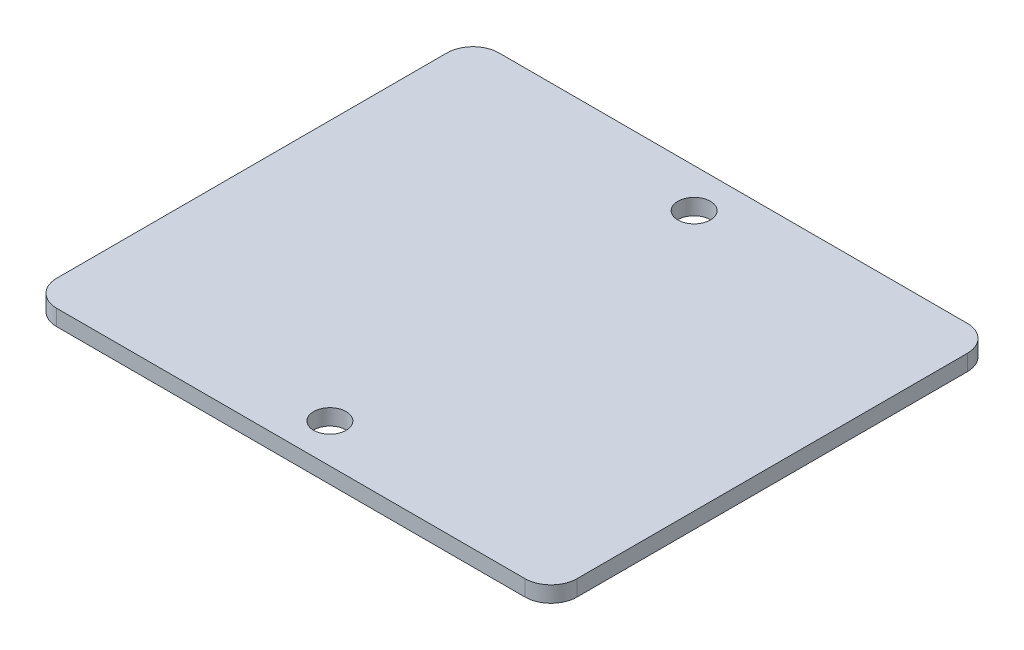
ISO-10303-21;
HEADER;
FILE_DESCRIPTION(('STEP AP214'),'2;1');
FILE_NAME('part.step','',(''),(''),'','','');
FILE_SCHEMA(('AUTOMOTIVE_DESIGN { 1 0 10303 214 1 1 1 1 }'));
ENDSEC;
DATA;
#1=APPLICATION_CONTEXT('core data for automotive mechanical design processes');
#2=APPLICATION_PROTOCOL_DEFINITION('international standard','automotive_design',2000,#1);
#3=PRODUCT_CONTEXT('',#1,'mechanical');
#4=PRODUCT('Part','Part','',(#3));
#5=PRODUCT_RELATED_PRODUCT_CATEGORY('part','',(#4));
#6=PRODUCT_DEFINITION_FORMATION('','',#4);
#7=PRODUCT_DEFINITION_CONTEXT('part definition',#1,'design');
#8=PRODUCT_DEFINITION('design','',#6,#7);
#9=PRODUCT_DEFINITION_SHAPE('','',#8);
#10=(LENGTH_UNIT() NAMED_UNIT(*) SI_UNIT(.MILLI.,.METRE.));
#11=(NAMED_UNIT(*) PLANE_ANGLE_UNIT() SI_UNIT($,.RADIAN.));
#12=(NAMED_UNIT(*) SI_UNIT($,.STERADIAN.) SOLID_ANGLE_UNIT());
#13=UNCERTAINTY_MEASURE_WITH_UNIT(LENGTH_MEASURE(1.E-05),#10,'distance_accuracy_value','');
#14=(GEOMETRIC_REPRESENTATION_CONTEXT(3) GLOBAL_UNCERTAINTY_ASSIGNED_CONTEXT((#13)) GLOBAL_UNIT_ASSIGNED_CONTEXT((#10,
#11,#12)) REPRESENTATION_CONTEXT('',''));
#15=CARTESIAN_POINT('',(0.,0.,0.));
#16=DIRECTION('',(0.,0.,1.));
#17=DIRECTION('',(1.,0.,0.));
#18=AXIS2_PLACEMENT_3D('',#15,#16,#17);
#19=CARTESIAN_POINT('',(0.,1.56,0.));
#20=DIRECTION('',(0.,-1.,0.));
#21=DIRECTION('',(0.,0.,-1.));
#22=AXIS2_PLACEMENT_3D('',#19,#20,#21);
#23=PLANE('',#22);
#24=DIRECTION('',(-1.,0.,0.));
#25=VECTOR('',#24,1.);
#26=CARTESIAN_POINT('',(-25.4,1.56,-21.59));
#27=LINE('',#26,#25);
#28=CARTESIAN_POINT('',(22.86,1.56,-21.59));
#29=VERTEX_POINT('',#28);
#30=CARTESIAN_POINT('',(-22.86,1.56,-21.59));
#31=VERTEX_POINT('',#30);
#32=EDGE_CURVE('E168',#29,#31,#27,.T.);
#33=ORIENTED_EDGE('',*,*,#32,.T.);
#34=CARTESIAN_POINT('',(-22.86,1.56,-19.05));
#35=DIRECTION('',(0.,-1.,0.));
#36=DIRECTION('',(0.,0.,-1.));
#37=AXIS2_PLACEMENT_3D('',#34,#35,#36);
#38=CIRCLE('',#37,2.54);
#39=CARTESIAN_POINT('',(-25.4,1.56,-19.05));
#40=VERTEX_POINT('',#39);
#41=EDGE_CURVE('E149',#31,#40,#38,.F.);
#42=ORIENTED_EDGE('',*,*,#41,.T.);
#43=DIRECTION('',(0.,0.,1.));
#44=VECTOR('',#43,1.);
#45=CARTESIAN_POINT('',(-25.4,1.56,21.59));
#46=LINE('',#45,#44);
#47=CARTESIAN_POINT('',(-25.4,1.56,19.05));
#48=VERTEX_POINT('',#47);
#49=EDGE_CURVE('E119',#40,#48,#46,.T.);
#50=ORIENTED_EDGE('',*,*,#49,.T.);
#51=CARTESIAN_POINT('',(-22.86,1.56,19.05));
#52=DIRECTION('',(0.,-1.,0.));
#53=DIRECTION('',(0.,0.,-1.));
#54=AXIS2_PLACEMENT_3D('',#51,#52,#53);
#55=CIRCLE('',#54,2.54);
#56=CARTESIAN_POINT('',(-22.86,1.56,21.59));
#57=VERTEX_POINT('',#56);
#58=EDGE_CURVE('E55',#48,#57,#55,.F.);
#59=ORIENTED_EDGE('',*,*,#58,.T.);
#60=DIRECTION('',(1.,0.,0.));
#61=VECTOR('',#60,1.);
#62=CARTESIAN_POINT('',(-25.4,1.56,21.59));
#63=LINE('',#62,#61);
#64=CARTESIAN_POINT('',(22.86,1.56,21.59));
#65=VERTEX_POINT('',#64);
#66=EDGE_CURVE('E135',#57,#65,#63,.T.);
#67=ORIENTED_EDGE('',*,*,#66,.T.);
#68=CARTESIAN_POINT('',(22.86,1.56,19.05));
#69=DIRECTION('',(0.,-1.,0.));
#70=DIRECTION('',(0.,0.,-1.));
#71=AXIS2_PLACEMENT_3D('',#68,#69,#70);
#72=CIRCLE('',#71,2.54);
#73=CARTESIAN_POINT('',(25.4,1.56,19.05));
#74=VERTEX_POINT('',#73);
#75=EDGE_CURVE('E146',#65,#74,#72,.F.);
#76=ORIENTED_EDGE('',*,*,#75,.T.);
#77=DIRECTION('',(0.,0.,-1.));
#78=VECTOR('',#77,1.);
#79=CARTESIAN_POINT('',(25.4,1.56,21.59));
#80=LINE('',#79,#78);
#81=CARTESIAN_POINT('',(25.4,1.56,-19.05));
#82=VERTEX_POINT('',#81);
#83=EDGE_CURVE('E129',#74,#82,#80,.T.);
#84=ORIENTED_EDGE('',*,*,#83,.T.);
#85=CARTESIAN_POINT('',(22.86,1.56,-19.05));
#86=DIRECTION('',(0.,-1.,0.));
#87=DIRECTION('',(0.,0.,-1.));
#88=AXIS2_PLACEMENT_3D('',#85,#86,#87);
#89=CIRCLE('',#88,2.54);
#90=EDGE_CURVE('E144',#82,#29,#89,.F.);
#91=ORIENTED_EDGE('',*,*,#90,.T.);
#92=EDGE_LOOP('',(#33,#42,#50,#59,#67,#76,#84,#91));
#93=FACE_BOUND('',#92,.T.);
#94=CARTESIAN_POINT('',(0.,1.56,-17.78));
#95=DIRECTION('',(0.,1.,0.));
#96=DIRECTION('',(0.,0.,1.));
#97=AXIS2_PLACEMENT_3D('',#94,#95,#96);
#98=CIRCLE('',#97,1.5875);
#99=CARTESIAN_POINT('',(0.,1.56,-19.3675));
#100=VERTEX_POINT('',#99);
#101=EDGE_CURVE('E173',#100,#100,#98,.T.);
#102=ORIENTED_EDGE('',*,*,#101,.F.);
#103=EDGE_LOOP('',(#102));
#104=FACE_BOUND('',#103,.T.);
#105=CARTESIAN_POINT('',(0.,1.56,17.78));
#106=DIRECTION('',(0.,1.,0.));
#107=DIRECTION('',(0.,0.,-1.));
#108=AXIS2_PLACEMENT_3D('',#105,#106,#107);
#109=CIRCLE('',#108,1.5875);
#110=CARTESIAN_POINT('',(0.,1.56,16.1925));
#111=VERTEX_POINT('',#110);
#112=EDGE_CURVE('E182',#111,#111,#109,.T.);
#113=ORIENTED_EDGE('',*,*,#112,.F.);
#114=EDGE_LOOP('',(#113));
#115=FACE_BOUND('',#114,.T.);
#116=ADVANCED_FACE('F33',(#93,#104,#115),#23,.F.);
#117=CARTESIAN_POINT('',(0.,0.,0.));
#118=DIRECTION('',(0.,-1.,0.));
#119=DIRECTION('',(0.,0.,-1.));
#120=AXIS2_PLACEMENT_3D('',#117,#118,#119);
#121=PLANE('',#120);
#122=CARTESIAN_POINT('',(0.,0.,-17.78));
#123=DIRECTION('',(0.,1.,0.));
#124=DIRECTION('',(0.,0.,1.));
#125=AXIS2_PLACEMENT_3D('',#122,#123,#124);
#126=CIRCLE('',#125,1.5875);
#127=CARTESIAN_POINT('',(0.,0.,-19.3675));
#128=VERTEX_POINT('',#127);
#129=EDGE_CURVE('E175',#128,#128,#126,.T.);
#130=ORIENTED_EDGE('',*,*,#129,.T.);
#131=EDGE_LOOP('',(#130));
#132=FACE_BOUND('',#131,.T.);
#133=DIRECTION('',(0.,0.,1.));
#134=VECTOR('',#133,1.);
#135=CARTESIAN_POINT('',(-25.4,0.,21.59));
#136=LINE('',#135,#134);
#137=CARTESIAN_POINT('',(-25.4,0.,-19.05));
#138=VERTEX_POINT('',#137);
#139=CARTESIAN_POINT('',(-25.4,0.,19.05));
#140=VERTEX_POINT('',#139);
#141=EDGE_CURVE('E117',#138,#140,#136,.T.);
#142=ORIENTED_EDGE('',*,*,#141,.F.);
#143=CARTESIAN_POINT('',(-22.86,0.,-19.05));
#144=DIRECTION('',(0.,-1.,0.));
#145=DIRECTION('',(0.,0.,-1.));
#146=AXIS2_PLACEMENT_3D('',#143,#144,#145);
#147=CIRCLE('',#146,2.54);
#148=CARTESIAN_POINT('',(-22.86,0.,-21.59));
#149=VERTEX_POINT('',#148);
#150=EDGE_CURVE('E100',#138,#149,#147,.T.);
#151=ORIENTED_EDGE('',*,*,#150,.T.);
#152=DIRECTION('',(-1.,0.,0.));
#153=VECTOR('',#152,1.);
#154=CARTESIAN_POINT('',(-25.4,0.,-21.59));
#155=LINE('',#154,#153);
#156=CARTESIAN_POINT('',(22.86,0.,-21.59));
#157=VERTEX_POINT('',#156);
#158=EDGE_CURVE('E127',#157,#149,#155,.T.);
#159=ORIENTED_EDGE('',*,*,#158,.F.);
#160=CARTESIAN_POINT('',(22.86,0.,-19.05));
#161=DIRECTION('',(0.,-1.,0.));
#162=DIRECTION('',(0.,0.,-1.));
#163=AXIS2_PLACEMENT_3D('',#160,#161,#162);
#164=CIRCLE('',#163,2.54);
#165=CARTESIAN_POINT('',(25.4,0.,-19.05));
#166=VERTEX_POINT('',#165);
#167=EDGE_CURVE('E120',#157,#166,#164,.T.);
#168=ORIENTED_EDGE('',*,*,#167,.T.);
#169=DIRECTION('',(0.,0.,-1.));
#170=VECTOR('',#169,1.);
#171=CARTESIAN_POINT('',(25.4,0.,21.59));
#172=LINE('',#171,#170);
#173=CARTESIAN_POINT('',(25.4,0.,19.05));
#174=VERTEX_POINT('',#173);
#175=EDGE_CURVE('E131',#174,#166,#172,.T.);
#176=ORIENTED_EDGE('',*,*,#175,.F.);
#177=CARTESIAN_POINT('',(22.86,0.,19.05));
#178=DIRECTION('',(0.,-1.,0.));
#179=DIRECTION('',(0.,0.,-1.));
#180=AXIS2_PLACEMENT_3D('',#177,#178,#179);
#181=CIRCLE('',#180,2.54);
#182=CARTESIAN_POINT('',(22.86,0.,21.59));
#183=VERTEX_POINT('',#182);
#184=EDGE_CURVE('E138',#174,#183,#181,.T.);
#185=ORIENTED_EDGE('',*,*,#184,.T.);
#186=DIRECTION('',(1.,0.,0.));
#187=VECTOR('',#186,1.);
#188=CARTESIAN_POINT('',(-25.4,0.,21.59));
#189=LINE('',#188,#187);
#190=CARTESIAN_POINT('',(-22.86,0.,21.59));
#191=VERTEX_POINT('',#190);
#192=EDGE_CURVE('E126',#191,#183,#189,.T.);
#193=ORIENTED_EDGE('',*,*,#192,.F.);
#194=CARTESIAN_POINT('',(-22.86,0.,19.05));
#195=DIRECTION('',(0.,-1.,0.));
#196=DIRECTION('',(0.,0.,-1.));
#197=AXIS2_PLACEMENT_3D('',#194,#195,#196);
#198=CIRCLE('',#197,2.54);
#199=EDGE_CURVE('E111',#191,#140,#198,.T.);
#200=ORIENTED_EDGE('',*,*,#199,.T.);
#201=EDGE_LOOP('',(#142,#151,#159,#168,#176,#185,#193,#200));
#202=FACE_BOUND('',#201,.T.);
#203=CARTESIAN_POINT('',(0.,0.,17.78));
#204=DIRECTION('',(0.,1.,0.));
#205=DIRECTION('',(0.,0.,-1.));
#206=AXIS2_PLACEMENT_3D('',#203,#204,#205);
#207=CIRCLE('',#206,1.5875);
#208=CARTESIAN_POINT('',(0.,0.,16.1925));
#209=VERTEX_POINT('',#208);
#210=EDGE_CURVE('E184',#209,#209,#207,.T.);
#211=ORIENTED_EDGE('',*,*,#210,.T.);
#212=EDGE_LOOP('',(#211));
#213=FACE_BOUND('',#212,.T.);
#214=ADVANCED_FACE('F123',(#132,#202,#213),#121,.T.);
#215=CARTESIAN_POINT('',(25.4,1.56,21.59));
#216=DIRECTION('',(-1.,0.,0.));
#217=DIRECTION('',(0.,0.,1.));
#218=AXIS2_PLACEMENT_3D('',#215,#216,#217);
#219=PLANE('',#218);
#220=ORIENTED_EDGE('',*,*,#83,.F.);
#221=DIRECTION('',(0.,-1.,0.));
#222=VECTOR('',#221,1.);
#223=CARTESIAN_POINT('',(25.4,1.56,19.05));
#224=LINE('',#223,#222);
#225=EDGE_CURVE('E11',#74,#174,#224,.T.);
#226=ORIENTED_EDGE('',*,*,#225,.T.);
#227=ORIENTED_EDGE('',*,*,#175,.T.);
#228=DIRECTION('',(0.,-1.,0.));
#229=VECTOR('',#228,1.);
#230=CARTESIAN_POINT('',(25.4,1.56,-19.05));
#231=LINE('',#230,#229);
#232=EDGE_CURVE('E41',#166,#82,#231,.F.);
#233=ORIENTED_EDGE('',*,*,#232,.T.);
#234=EDGE_LOOP('',(#220,#226,#227,#233));
#235=FACE_BOUND('',#234,.T.);
#236=ADVANCED_FACE('F159',(#235),#219,.F.);
#237=CARTESIAN_POINT('',(-25.4,1.56,-21.59));
#238=DIRECTION('',(0.,0.,1.));
#239=DIRECTION('',(1.,0.,0.));
#240=AXIS2_PLACEMENT_3D('',#237,#238,#239);
#241=PLANE('',#240);
#242=ORIENTED_EDGE('',*,*,#158,.T.);
#243=DIRECTION('',(0.,-1.,0.));
#244=VECTOR('',#243,1.);
#245=CARTESIAN_POINT('',(-22.86,1.56,-21.59));
#246=LINE('',#245,#244);
#247=EDGE_CURVE('E105',#149,#31,#246,.F.);
#248=ORIENTED_EDGE('',*,*,#247,.T.);
#249=ORIENTED_EDGE('',*,*,#32,.F.);
#250=DIRECTION('',(0.,-1.,0.));
#251=VECTOR('',#250,1.);
#252=CARTESIAN_POINT('',(22.86,1.56,-21.59));
#253=LINE('',#252,#251);
#254=EDGE_CURVE('E110',#29,#157,#253,.T.);
#255=ORIENTED_EDGE('',*,*,#254,.T.);
#256=EDGE_LOOP('',(#242,#248,#249,#255));
#257=FACE_BOUND('',#256,.T.);
#258=ADVANCED_FACE('F172',(#257),#241,.F.);
#259=CARTESIAN_POINT('',(-25.4,1.56,21.59));
#260=DIRECTION('',(1.,0.,0.));
#261=DIRECTION('',(0.,0.,-1.));
#262=AXIS2_PLACEMENT_3D('',#259,#260,#261);
#263=PLANE('',#262);
#264=ORIENTED_EDGE('',*,*,#49,.F.);
#265=DIRECTION('',(0.,-1.,0.));
#266=VECTOR('',#265,1.);
#267=CARTESIAN_POINT('',(-25.4,1.56,-19.05));
#268=LINE('',#267,#266);
#269=EDGE_CURVE('E104',#40,#138,#268,.T.);
#270=ORIENTED_EDGE('',*,*,#269,.T.);
#271=ORIENTED_EDGE('',*,*,#141,.T.);
#272=DIRECTION('',(0.,-1.,0.));
#273=VECTOR('',#272,1.);
#274=CARTESIAN_POINT('',(-25.4,1.56,19.05));
#275=LINE('',#274,#273);
#276=EDGE_CURVE('E121',#140,#48,#275,.F.);
#277=ORIENTED_EDGE('',*,*,#276,.T.);
#278=EDGE_LOOP('',(#264,#270,#271,#277));
#279=FACE_BOUND('',#278,.T.);
#280=ADVANCED_FACE('F116',(#279),#263,.F.);
#281=CARTESIAN_POINT('',(-25.4,1.56,21.59));
#282=DIRECTION('',(0.,0.,-1.));
#283=DIRECTION('',(-1.,0.,0.));
#284=AXIS2_PLACEMENT_3D('',#281,#282,#283);
#285=PLANE('',#284);
#286=ORIENTED_EDGE('',*,*,#66,.F.);
#287=DIRECTION('',(0.,-1.,0.));
#288=VECTOR('',#287,1.);
#289=CARTESIAN_POINT('',(-22.86,1.56,21.59));
#290=LINE('',#289,#288);
#291=EDGE_CURVE('E152',#57,#191,#290,.T.);
#292=ORIENTED_EDGE('',*,*,#291,.T.);
#293=ORIENTED_EDGE('',*,*,#192,.T.);
#294=DIRECTION('',(0.,-1.,0.));
#295=VECTOR('',#294,1.);
#296=CARTESIAN_POINT('',(22.86,1.56,21.59));
#297=LINE('',#296,#295);
#298=EDGE_CURVE('E48',#183,#65,#297,.F.);
#299=ORIENTED_EDGE('',*,*,#298,.T.);
#300=EDGE_LOOP('',(#286,#292,#293,#299));
#301=FACE_BOUND('',#300,.T.);
#302=ADVANCED_FACE('F204',(#301),#285,.F.);
#303=CARTESIAN_POINT('',(0.,1.56,-17.78));
#304=DIRECTION('',(0.,-1.,0.));
#305=DIRECTION('',(0.,0.,-1.));
#306=AXIS2_PLACEMENT_3D('',#303,#304,#305);
#307=CYLINDRICAL_SURFACE('',#306,1.5875);
#308=CARTESIAN_POINT('',(0.,1.56,-19.3675));
#309=CARTESIAN_POINT('',(0.,1.54375,-19.3675));
#310=CARTESIAN_POINT('',(0.,1.5275,-19.3675));
#311=CARTESIAN_POINT('',(0.,1.495,-19.3675));
#312=CARTESIAN_POINT('',(0.,1.47875,-19.3675));
#313=CARTESIAN_POINT('',(0.,1.44625,-19.3675));
#314=CARTESIAN_POINT('',(0.,1.43,-19.3675));
#315=CARTESIAN_POINT('',(0.,1.3975,-19.3675));
#316=CARTESIAN_POINT('',(0.,1.38125,-19.3675));
#317=CARTESIAN_POINT('',(0.,1.34875,-19.3675));
#318=CARTESIAN_POINT('',(0.,1.3325,-19.3675));
#319=CARTESIAN_POINT('',(0.,1.3,-19.3675));
#320=CARTESIAN_POINT('',(0.,1.28375,-19.3675));
#321=CARTESIAN_POINT('',(0.,1.25125,-19.3675));
#322=CARTESIAN_POINT('',(0.,1.235,-19.3675));
#323=CARTESIAN_POINT('',(0.,1.2025,-19.3675));
#324=CARTESIAN_POINT('',(0.,1.18625,-19.3675));
#325=CARTESIAN_POINT('',(0.,1.15375,-19.3675));
#326=CARTESIAN_POINT('',(0.,1.1375,-19.3675));
#327=CARTESIAN_POINT('',(0.,1.105,-19.3675));
#328=CARTESIAN_POINT('',(0.,1.08875,-19.3675));
#329=CARTESIAN_POINT('',(0.,1.05625,-19.3675));
#330=CARTESIAN_POINT('',(0.,1.04,-19.3675));
#331=CARTESIAN_POINT('',(0.,1.0075,-19.3675));
#332=CARTESIAN_POINT('',(0.,0.99125,-19.3675));
#333=CARTESIAN_POINT('',(0.,0.95875,-19.3675));
#334=CARTESIAN_POINT('',(0.,0.9425,-19.3675));
#335=CARTESIAN_POINT('',(0.,0.91,-19.3675));
#336=CARTESIAN_POINT('',(0.,0.89375,-19.3675));
#337=CARTESIAN_POINT('',(0.,0.86125,-19.3675));
#338=CARTESIAN_POINT('',(0.,0.845,-19.3675));
#339=CARTESIAN_POINT('',(0.,0.8125,-19.3675));
#340=CARTESIAN_POINT('',(0.,0.79625,-19.3675));
#341=CARTESIAN_POINT('',(0.,0.76375,-19.3675));
#342=CARTESIAN_POINT('',(0.,0.7475,-19.3675));
#343=CARTESIAN_POINT('',(0.,0.715,-19.3675));
#344=CARTESIAN_POINT('',(0.,0.69875,-19.3675));
#345=CARTESIAN_POINT('',(0.,0.66625,-19.3675));
#346=CARTESIAN_POINT('',(0.,0.65,-19.3675));
#347=CARTESIAN_POINT('',(0.,0.6175,-19.3675));
#348=CARTESIAN_POINT('',(0.,0.60125,-19.3675));
#349=CARTESIAN_POINT('',(0.,0.56875,-19.3675));
#350=CARTESIAN_POINT('',(0.,0.5525,-19.3675));
#351=CARTESIAN_POINT('',(0.,0.52,-19.3675));
#352=CARTESIAN_POINT('',(0.,0.50375,-19.3675));
#353=CARTESIAN_POINT('',(0.,0.47125,-19.3675));
#354=CARTESIAN_POINT('',(0.,0.455,-19.3675));
#355=CARTESIAN_POINT('',(0.,0.4225,-19.3675));
#356=CARTESIAN_POINT('',(0.,0.40625,-19.3675));
#357=CARTESIAN_POINT('',(0.,0.37375,-19.3675));
#358=CARTESIAN_POINT('',(0.,0.3575,-19.3675));
#359=CARTESIAN_POINT('',(0.,0.325,-19.3675));
#360=CARTESIAN_POINT('',(0.,0.30875,-19.3675));
#361=CARTESIAN_POINT('',(0.,0.27625,-19.3675));
#362=CARTESIAN_POINT('',(0.,0.26,-19.3675));
#363=CARTESIAN_POINT('',(0.,0.2275,-19.3675));
#364=CARTESIAN_POINT('',(0.,0.21125,-19.3675));
#365=CARTESIAN_POINT('',(0.,0.17875,-19.3675));
#366=CARTESIAN_POINT('',(0.,0.1625,-19.3675));
#367=CARTESIAN_POINT('',(0.,0.13,-19.3675));
#368=CARTESIAN_POINT('',(0.,0.11375,-19.3675));
#369=CARTESIAN_POINT('',(0.,0.0812499999999999,-19.3675));
#370=CARTESIAN_POINT('',(0.,0.0649999999999999,-19.3675));
#371=CARTESIAN_POINT('',(0.,0.0325,-19.3675));
#372=CARTESIAN_POINT('',(0.,0.01625,-19.3675));
#373=CARTESIAN_POINT('',(0.,0.,-19.3675));
#374=B_SPLINE_CURVE_WITH_KNOTS('',3,(#308,#309,#310,#311,#312,#313,#314,#315,#316,#317,#318,
#319,#320,#321,#322,#323,#324,#325,#326,#327,#328,#329,#330,#331,#332,#333,#334,#335,#336,#337,
#338,#339,#340,#341,#342,#343,#344,#345,#346,#347,#348,#349,#350,#351,#352,#353,#354,#355,#356,
#357,#358,#359,#360,#361,#362,#363,#364,#365,#366,#367,#368,#369,#370,#371,#372,#373),
.UNSPECIFIED.,.F.,.F.,(4,2,2,2,2,2,2,2,2,2,2,2,2,2,2,2,2,2,2,2,2,2,2,2,2,2,2,2,2,2,2,2,4),(0.,
0.04875,0.0974999999999999,0.14625,0.195,0.24375,0.2925,0.34125,0.39,0.43875,0.4875,0.53625,
0.585,0.63375,0.6825,0.73125,0.78,0.82875,0.8775,0.92625,0.975,1.02375,1.0725,1.12125,1.17,
1.21875,1.2675,1.31625,1.365,1.41375,1.4625,1.51125,1.56),.UNSPECIFIED.);
#375=EDGE_CURVE('BSEAM201',#100,#128,#374,.T.);
#376=ORIENTED_EDGE('',*,*,#101,.T.);
#377=ORIENTED_EDGE('',*,*,#129,.F.);
#378=ORIENTED_EDGE('',*,*,#375,.T.);
#379=ORIENTED_EDGE('',*,*,#375,.F.);
#380=EDGE_LOOP('',(#376,#378,#377,#379));
#381=FACE_BOUND('',#380,.T.);
#382=ADVANCED_FACE('F201',(#381),#307,.F.);
#383=CARTESIAN_POINT('',(0.,1.56,17.78));
#384=DIRECTION('',(0.,-1.,0.));
#385=DIRECTION('',(0.,0.,-1.));
#386=AXIS2_PLACEMENT_3D('',#383,#384,#385);
#387=CYLINDRICAL_SURFACE('',#386,1.5875);
#388=CARTESIAN_POINT('',(0.,1.56,16.1925));
#389=CARTESIAN_POINT('',(0.,1.54375,16.1925));
#390=CARTESIAN_POINT('',(0.,1.5275,16.1925));
#391=CARTESIAN_POINT('',(0.,1.495,16.1925));
#392=CARTESIAN_POINT('',(0.,1.47875,16.1925));
#393=CARTESIAN_POINT('',(0.,1.44625,16.1925));
#394=CARTESIAN_POINT('',(0.,1.43,16.1925));
#395=CARTESIAN_POINT('',(0.,1.3975,16.1925));
#396=CARTESIAN_POINT('',(0.,1.38125,16.1925));
#397=CARTESIAN_POINT('',(0.,1.34875,16.1925));
#398=CARTESIAN_POINT('',(0.,1.3325,16.1925));
#399=CARTESIAN_POINT('',(0.,1.3,16.1925));
#400=CARTESIAN_POINT('',(0.,1.28375,16.1925));
#401=CARTESIAN_POINT('',(0.,1.25125,16.1925));
#402=CARTESIAN_POINT('',(0.,1.235,16.1925));
#403=CARTESIAN_POINT('',(0.,1.2025,16.1925));
#404=CARTESIAN_POINT('',(0.,1.18625,16.1925));
#405=CARTESIAN_POINT('',(0.,1.15375,16.1925));
#406=CARTESIAN_POINT('',(0.,1.1375,16.1925));
#407=CARTESIAN_POINT('',(0.,1.105,16.1925));
#408=CARTESIAN_POINT('',(0.,1.08875,16.1925));
#409=CARTESIAN_POINT('',(0.,1.05625,16.1925));
#410=CARTESIAN_POINT('',(0.,1.04,16.1925));
#411=CARTESIAN_POINT('',(0.,1.0075,16.1925));
#412=CARTESIAN_POINT('',(0.,0.99125,16.1925));
#413=CARTESIAN_POINT('',(0.,0.95875,16.1925));
#414=CARTESIAN_POINT('',(0.,0.9425,16.1925));
#415=CARTESIAN_POINT('',(0.,0.91,16.1925));
#416=CARTESIAN_POINT('',(0.,0.89375,16.1925));
#417=CARTESIAN_POINT('',(0.,0.86125,16.1925));
#418=CARTESIAN_POINT('',(0.,0.845,16.1925));
#419=CARTESIAN_POINT('',(0.,0.8125,16.1925));
#420=CARTESIAN_POINT('',(0.,0.79625,16.1925));
#421=CARTESIAN_POINT('',(0.,0.76375,16.1925));
#422=CARTESIAN_POINT('',(0.,0.7475,16.1925));
#423=CARTESIAN_POINT('',(0.,0.715,16.1925));
#424=CARTESIAN_POINT('',(0.,0.69875,16.1925));
#425=CARTESIAN_POINT('',(0.,0.66625,16.1925));
#426=CARTESIAN_POINT('',(0.,0.65,16.1925));
#427=CARTESIAN_POINT('',(0.,0.6175,16.1925));
#428=CARTESIAN_POINT('',(0.,0.60125,16.1925));
#429=CARTESIAN_POINT('',(0.,0.56875,16.1925));
#430=CARTESIAN_POINT('',(0.,0.5525,16.1925));
#431=CARTESIAN_POINT('',(0.,0.52,16.1925));
#432=CARTESIAN_POINT('',(0.,0.50375,16.1925));
#433=CARTESIAN_POINT('',(0.,0.47125,16.1925));
#434=CARTESIAN_POINT('',(0.,0.455,16.1925));
#435=CARTESIAN_POINT('',(0.,0.4225,16.1925));
#436=CARTESIAN_POINT('',(0.,0.40625,16.1925));
#437=CARTESIAN_POINT('',(0.,0.37375,16.1925));
#438=CARTESIAN_POINT('',(0.,0.3575,16.1925));
#439=CARTESIAN_POINT('',(0.,0.325,16.1925));
#440=CARTESIAN_POINT('',(0.,0.30875,16.1925));
#441=CARTESIAN_POINT('',(0.,0.27625,16.1925));
#442=CARTESIAN_POINT('',(0.,0.26,16.1925));
#443=CARTESIAN_POINT('',(0.,0.2275,16.1925));
#444=CARTESIAN_POINT('',(0.,0.21125,16.1925));
#445=CARTESIAN_POINT('',(0.,0.17875,16.1925));
#446=CARTESIAN_POINT('',(0.,0.1625,16.1925));
#447=CARTESIAN_POINT('',(0.,0.13,16.1925));
#448=CARTESIAN_POINT('',(0.,0.11375,16.1925));
#449=CARTESIAN_POINT('',(0.,0.0812499999999999,16.1925));
#450=CARTESIAN_POINT('',(0.,0.0649999999999999,16.1925));
#451=CARTESIAN_POINT('',(0.,0.0325,16.1925));
#452=CARTESIAN_POINT('',(0.,0.01625,16.1925));
#453=CARTESIAN_POINT('',(0.,0.,16.1925));
#454=B_SPLINE_CURVE_WITH_KNOTS('',3,(#388,#389,#390,#391,#392,#393,#394,#395,#396,#397,#398,
#399,#400,#401,#402,#403,#404,#405,#406,#407,#408,#409,#410,#411,#412,#413,#414,#415,#416,#417,
#418,#419,#420,#421,#422,#423,#424,#425,#426,#427,#428,#429,#430,#431,#432,#433,#434,#435,#436,
#437,#438,#439,#440,#441,#442,#443,#444,#445,#446,#447,#448,#449,#450,#451,#452,#453),
.UNSPECIFIED.,.F.,.F.,(4,2,2,2,2,2,2,2,2,2,2,2,2,2,2,2,2,2,2,2,2,2,2,2,2,2,2,2,2,2,2,2,4),(0.,
0.04875,0.0974999999999999,0.14625,0.195,0.24375,0.2925,0.34125,0.39,0.43875,0.4875,0.53625,
0.585,0.63375,0.6825,0.73125,0.78,0.82875,0.8775,0.92625,0.975,1.02375,1.0725,1.12125,1.17,
1.21875,1.2675,1.31625,1.365,1.41375,1.4625,1.51125,1.56),.UNSPECIFIED.);
#455=EDGE_CURVE('BSEAM190',#111,#209,#454,.T.);
#456=ORIENTED_EDGE('',*,*,#112,.T.);
#457=ORIENTED_EDGE('',*,*,#210,.F.);
#458=ORIENTED_EDGE('',*,*,#455,.T.);
#459=ORIENTED_EDGE('',*,*,#455,.F.);
#460=EDGE_LOOP('',(#456,#458,#457,#459));
#461=FACE_BOUND('',#460,.T.);
#462=ADVANCED_FACE('F190',(#461),#387,.F.);
#463=CARTESIAN_POINT('',(-22.86,1.56,-19.05));
#464=DIRECTION('',(0.,-1.,0.));
#465=DIRECTION('',(0.,0.,-1.));
#466=AXIS2_PLACEMENT_3D('',#463,#464,#465);
#467=CYLINDRICAL_SURFACE('',#466,2.54);
#468=ORIENTED_EDGE('',*,*,#41,.F.);
#469=ORIENTED_EDGE('',*,*,#247,.F.);
#470=ORIENTED_EDGE('',*,*,#150,.F.);
#471=ORIENTED_EDGE('',*,*,#269,.F.);
#472=EDGE_LOOP('',(#468,#469,#470,#471));
#473=FACE_BOUND('',#472,.T.);
#474=ADVANCED_FACE('F103',(#473),#467,.T.);
#475=CARTESIAN_POINT('',(-22.86,1.56,19.05));
#476=DIRECTION('',(0.,-1.,0.));
#477=DIRECTION('',(0.,0.,-1.));
#478=AXIS2_PLACEMENT_3D('',#475,#476,#477);
#479=CYLINDRICAL_SURFACE('',#478,2.54);
#480=ORIENTED_EDGE('',*,*,#58,.F.);
#481=ORIENTED_EDGE('',*,*,#276,.F.);
#482=ORIENTED_EDGE('',*,*,#199,.F.);
#483=ORIENTED_EDGE('',*,*,#291,.F.);
#484=EDGE_LOOP('',(#480,#481,#482,#483));
#485=FACE_BOUND('',#484,.T.);
#486=ADVANCED_FACE('F215',(#485),#479,.T.);
#487=CARTESIAN_POINT('',(22.86,1.56,19.05));
#488=DIRECTION('',(0.,-1.,0.));
#489=DIRECTION('',(0.,0.,-1.));
#490=AXIS2_PLACEMENT_3D('',#487,#488,#489);
#491=CYLINDRICAL_SURFACE('',#490,2.54);
#492=ORIENTED_EDGE('',*,*,#75,.F.);
#493=ORIENTED_EDGE('',*,*,#298,.F.);
#494=ORIENTED_EDGE('',*,*,#184,.F.);
#495=ORIENTED_EDGE('',*,*,#225,.F.);
#496=EDGE_LOOP('',(#492,#493,#494,#495));
#497=FACE_BOUND('',#496,.T.);
#498=ADVANCED_FACE('F217',(#497),#491,.T.);
#499=CARTESIAN_POINT('',(22.86,1.56,-19.05));
#500=DIRECTION('',(0.,-1.,0.));
#501=DIRECTION('',(0.,0.,-1.));
#502=AXIS2_PLACEMENT_3D('',#499,#500,#501);
#503=CYLINDRICAL_SURFACE('',#502,2.54);
#504=ORIENTED_EDGE('',*,*,#90,.F.);
#505=ORIENTED_EDGE('',*,*,#232,.F.);
#506=ORIENTED_EDGE('',*,*,#167,.F.);
#507=ORIENTED_EDGE('',*,*,#254,.F.);
#508=EDGE_LOOP('',(#504,#505,#506,#507));
#509=FACE_BOUND('',#508,.T.);
#510=ADVANCED_FACE('F35',(#509),#503,.T.);
#511=CLOSED_SHELL('',(#116,#214,#236,#258,#280,#302,#382,#462,#474,#486,#498,#510));
#512=MANIFOLD_SOLID_BREP('B2',#511);
#513=ADVANCED_BREP_SHAPE_REPRESENTATION('',(#18,#512),#14);
#514=SHAPE_DEFINITION_REPRESENTATION(#9,#513);
ENDSEC;
END-ISO-10303-21;
